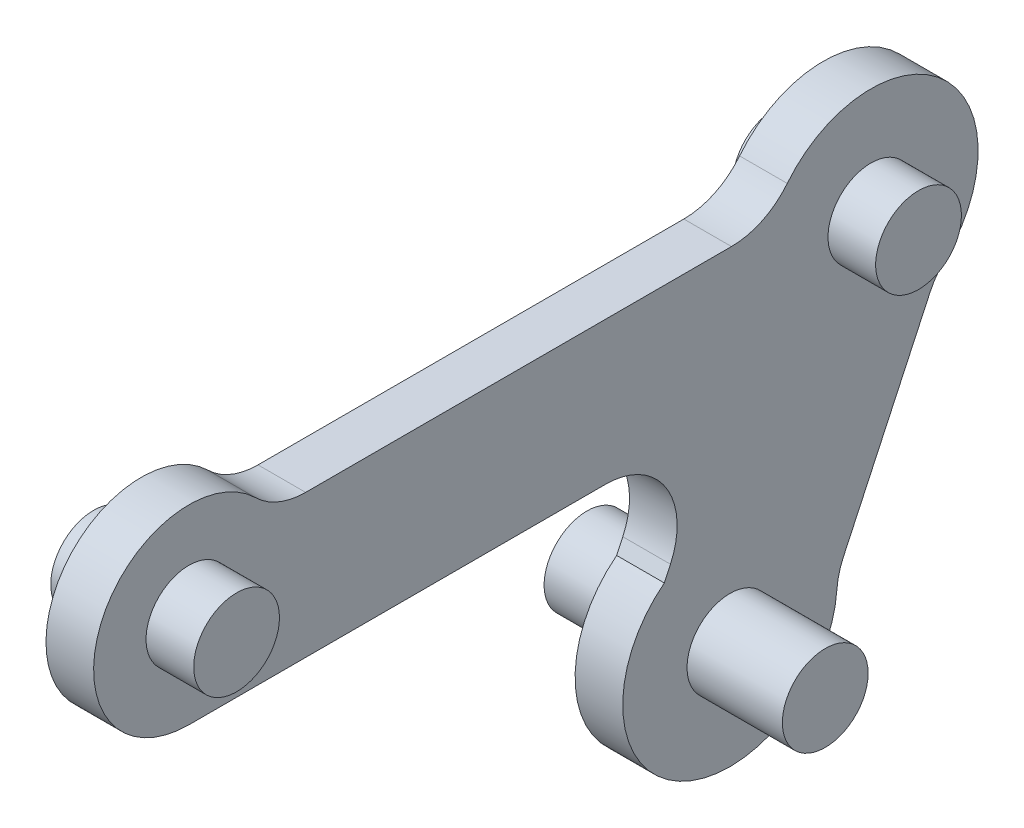
ISO-10303-21;
HEADER;
FILE_DESCRIPTION(('STEP AP214'),'2;1');
FILE_NAME('part.step','',(''),(''),'','','');
FILE_SCHEMA(('AUTOMOTIVE_DESIGN { 1 0 10303 214 1 1 1 1 }'));
ENDSEC;
DATA;
#1=APPLICATION_CONTEXT('core data for automotive mechanical design processes');
#2=APPLICATION_PROTOCOL_DEFINITION('international standard','automotive_design',2000,#1);
#3=PRODUCT_CONTEXT('',#1,'mechanical');
#4=PRODUCT('Part','Part','',(#3));
#5=PRODUCT_RELATED_PRODUCT_CATEGORY('part','',(#4));
#6=PRODUCT_DEFINITION_FORMATION('','',#4);
#7=PRODUCT_DEFINITION_CONTEXT('part definition',#1,'design');
#8=PRODUCT_DEFINITION('design','',#6,#7);
#9=PRODUCT_DEFINITION_SHAPE('','',#8);
#10=(LENGTH_UNIT() NAMED_UNIT(*) SI_UNIT(.MILLI.,.METRE.));
#11=(NAMED_UNIT(*) PLANE_ANGLE_UNIT() SI_UNIT($,.RADIAN.));
#12=(NAMED_UNIT(*) SI_UNIT($,.STERADIAN.) SOLID_ANGLE_UNIT());
#13=UNCERTAINTY_MEASURE_WITH_UNIT(LENGTH_MEASURE(1.E-05),#10,'distance_accuracy_value','');
#14=(GEOMETRIC_REPRESENTATION_CONTEXT(3) GLOBAL_UNCERTAINTY_ASSIGNED_CONTEXT((#13)) GLOBAL_UNIT_ASSIGNED_CONTEXT((#10,
#11,#12)) REPRESENTATION_CONTEXT('',''));
#15=CARTESIAN_POINT('',(0.,0.,0.));
#16=DIRECTION('',(0.,0.,1.));
#17=DIRECTION('',(1.,0.,0.));
#18=AXIS2_PLACEMENT_3D('',#15,#16,#17);
#19=CARTESIAN_POINT('',(0.,-2.,25.));
#20=DIRECTION('',(1.,0.,0.));
#21=DIRECTION('',(0.,0.,-1.));
#22=AXIS2_PLACEMENT_3D('',#19,#20,#21);
#23=PLANE('',#22);
#24=CARTESIAN_POINT('',(0.,-14.3787820654765,2.29142451622356));
#25=DIRECTION('',(1.,0.,0.));
#26=DIRECTION('',(0.,0.,-1.));
#27=AXIS2_PLACEMENT_3D('',#24,#25,#26);
#28=CIRCLE('',#27,1.8);
#29=CARTESIAN_POINT('',(0.,-14.3787820654765,0.491424516223557));
#30=VERTEX_POINT('',#29);
#31=EDGE_CURVE('E421',#30,#30,#28,.T.);
#32=ORIENTED_EDGE('',*,*,#31,.T.);
#33=EDGE_LOOP('',(#32));
#34=FACE_BOUND('',#33,.T.);
#35=CARTESIAN_POINT('',(0.,-1.69047304696279,-3.62523114814654));
#36=DIRECTION('',(1.,0.,0.));
#37=DIRECTION('',(0.,0.,-1.));
#38=AXIS2_PLACEMENT_3D('',#35,#36,#37);
#39=CIRCLE('',#38,1.8);
#40=CARTESIAN_POINT('',(0.,-1.69047304696279,-5.42523114814654));
#41=VERTEX_POINT('',#40);
#42=EDGE_CURVE('E409',#41,#41,#39,.T.);
#43=ORIENTED_EDGE('',*,*,#42,.T.);
#44=EDGE_LOOP('',(#43));
#45=FACE_BOUND('',#44,.T.);
#46=CARTESIAN_POINT('',(0.,-2.,25.));
#47=DIRECTION('',(1.,0.,0.));
#48=DIRECTION('',(0.,0.,-1.));
#49=AXIS2_PLACEMENT_3D('',#46,#47,#48);
#50=CIRCLE('',#49,1.8);
#51=CARTESIAN_POINT('',(0.,-2.,23.2));
#52=VERTEX_POINT('',#51);
#53=EDGE_CURVE('E403',#52,#52,#50,.T.);
#54=ORIENTED_EDGE('',*,*,#53,.T.);
#55=EDGE_LOOP('',(#54));
#56=FACE_BOUND('',#55,.T.);
#57=CARTESIAN_POINT('',(0.,-1.69047304696279,-3.62523114814653));
#58=DIRECTION('',(1.,0.,0.));
#59=DIRECTION('',(0.,0.,-1.));
#60=AXIS2_PLACEMENT_3D('',#57,#58,#59);
#61=CIRCLE('',#60,4.50000000000002);
#62=CARTESIAN_POINT('',(0.,-4.92965478602828,-6.74896315670695));
#63=VERTEX_POINT('',#62);
#64=CARTESIAN_POINT('',(0.,1.12381078121489,-0.113848723166622));
#65=VERTEX_POINT('',#64);
#66=EDGE_CURVE('E242',#63,#65,#61,.T.);
#67=ORIENTED_EDGE('',*,*,#66,.F.);
#68=CARTESIAN_POINT('',(0.,-7.08910927873859,-8.83145116241388));
#69=DIRECTION('',(1.,0.,0.));
#70=DIRECTION('',(0.,0.,-1.));
#71=AXIS2_PLACEMENT_3D('',#68,#69,#70);
#72=CIRCLE('',#71,3.);
#73=CARTESIAN_POINT('',(0.,-5.82125449351649,-6.11252780130393));
#74=VERTEX_POINT('',#73);
#75=EDGE_CURVE('E295',#63,#74,#72,.T.);
#76=ORIENTED_EDGE('',*,*,#75,.T.);
#77=DIRECTION('',(0.,-0.90630778703665,0.4226182617407));
#78=VECTOR('',#77,1.);
#79=CARTESIAN_POINT('',(0.,-3.38094609392561,-7.25046229629313));
#80=LINE('',#79,#78);
#81=CARTESIAN_POINT('',(0.,-13.6289467128478,-2.47174112691255));
#82=VERTEX_POINT('',#81);
#83=EDGE_CURVE('E253',#74,#82,#80,.T.);
#84=ORIENTED_EDGE('',*,*,#83,.T.);
#85=CARTESIAN_POINT('',(0.,-14.8968014980699,-5.1906644880225));
#86=DIRECTION('',(1.,0.,0.));
#87=DIRECTION('',(0.,0.,-1.));
#88=AXIS2_PLACEMENT_3D('',#85,#86,#87);
#89=CIRCLE('',#88,3.);
#90=CARTESIAN_POINT('',(0.,-14.6895937250323,-2.19782888632421));
#91=VERTEX_POINT('',#90);
#92=EDGE_CURVE('E291',#82,#91,#89,.T.);
#93=ORIENTED_EDGE('',*,*,#92,.T.);
#94=CARTESIAN_POINT('',(0.,-14.3787820654759,2.29142451622326));
#95=DIRECTION('',(1.,0.,0.));
#96=DIRECTION('',(0.,0.,-1.));
#97=AXIS2_PLACEMENT_3D('',#94,#95,#96);
#98=CIRCLE('',#97,4.50000000000002);
#99=CARTESIAN_POINT('',(0.,-10.8199076508771,5.0454057981339));
#100=VERTEX_POINT('',#99);
#101=EDGE_CURVE('E263',#100,#91,#98,.T.);
#102=ORIENTED_EDGE('',*,*,#101,.F.);
#103=DIRECTION('',(0.,-0.906307787036648,0.422618261740704));
#104=VECTOR('',#103,1.);
#105=CARTESIAN_POINT('',(0.,0.,0.));
#106=LINE('',#105,#104);
#107=CARTESIAN_POINT('',(0.,-10.2678547852221,4.78797931917258));
#108=VERTEX_POINT('',#107);
#109=EDGE_CURVE('E256',#108,#100,#106,.T.);
#110=ORIENTED_EDGE('',*,*,#109,.F.);
#111=CARTESIAN_POINT('',(0.,-9.00000000000001,7.50690268028253));
#112=DIRECTION('',(1.,0.,0.));
#113=DIRECTION('',(0.,0.,-1.));
#114=AXIS2_PLACEMENT_3D('',#111,#112,#113);
#115=CIRCLE('',#114,3.);
#116=CARTESIAN_POINT('',(0.,-6.,7.50690268028252));
#117=VERTEX_POINT('',#116);
#118=EDGE_CURVE('E235',#108,#117,#115,.T.);
#119=ORIENTED_EDGE('',*,*,#118,.T.);
#120=DIRECTION('',(0.,0.,-1.));
#121=VECTOR('',#120,1.);
#122=CARTESIAN_POINT('',(0.,-6.,25.));
#123=LINE('',#122,#121);
#124=CARTESIAN_POINT('',(0.,-5.99999999999999,25.));
#125=VERTEX_POINT('',#124);
#126=EDGE_CURVE('E227',#125,#117,#123,.T.);
#127=ORIENTED_EDGE('',*,*,#126,.F.);
#128=CARTESIAN_POINT('',(0.,-2.,25.));
#129=DIRECTION('',(1.,0.,0.));
#130=DIRECTION('',(0.,0.,-1.));
#131=AXIS2_PLACEMENT_3D('',#128,#129,#130);
#132=CIRCLE('',#131,3.99999999999999);
#133=CARTESIAN_POINT('',(0.,0.857142857142855,22.200583151105));
#134=VERTEX_POINT('',#133);
#135=EDGE_CURVE('E213',#134,#125,#132,.T.);
#136=ORIENTED_EDGE('',*,*,#135,.F.);
#137=CARTESIAN_POINT('',(0.,3.,20.1010205144337));
#138=DIRECTION('',(1.,0.,0.));
#139=DIRECTION('',(0.,0.,-1.));
#140=AXIS2_PLACEMENT_3D('',#137,#138,#139);
#141=CIRCLE('',#140,3.);
#142=CARTESIAN_POINT('',(0.,0.,20.1010205144337));
#143=VERTEX_POINT('',#142);
#144=EDGE_CURVE('E133',#134,#143,#141,.T.);
#145=ORIENTED_EDGE('',*,*,#144,.T.);
#146=DIRECTION('',(0.,0.,-1.));
#147=VECTOR('',#146,1.);
#148=CARTESIAN_POINT('',(0.,0.,25.));
#149=LINE('',#148,#147);
#150=CARTESIAN_POINT('',(0.,0.,2.22707289348664));
#151=VERTEX_POINT('',#150);
#152=EDGE_CURVE('E236',#143,#151,#149,.T.);
#153=ORIENTED_EDGE('',*,*,#152,.T.);
#154=CARTESIAN_POINT('',(0.,3.,2.22707289348664));
#155=DIRECTION('',(1.,0.,0.));
#156=DIRECTION('',(0.,0.,-1.));
#157=AXIS2_PLACEMENT_3D('',#154,#155,#156);
#158=CIRCLE('',#157,3.);
#159=EDGE_CURVE('E302',#151,#65,#158,.T.);
#160=ORIENTED_EDGE('',*,*,#159,.T.);
#161=EDGE_LOOP('',(#67,#76,#84,#93,#102,#110,#119,#127,#136,#145,#153,#160));
#162=FACE_BOUND('',#161,.T.);
#163=ADVANCED_FACE('F125',(#34,#45,#56,#162),#23,.F.);
#164=CARTESIAN_POINT('',(2.,-2.,25.));
#165=DIRECTION('',(1.,0.,0.));
#166=DIRECTION('',(0.,0.,-1.));
#167=AXIS2_PLACEMENT_3D('',#164,#165,#166);
#168=PLANE('',#167);
#169=CARTESIAN_POINT('',(2.,-14.3787820654765,2.29142451622356));
#170=DIRECTION('',(1.,0.,0.));
#171=DIRECTION('',(0.,0.,-1.00000000000004));
#172=AXIS2_PLACEMENT_3D('',#169,#170,#171);
#173=CIRCLE('',#172,1.8);
#174=CARTESIAN_POINT('',(2.,-14.3787820654765,0.491424516223483));
#175=VERTEX_POINT('',#174);
#176=EDGE_CURVE('E415',#175,#175,#173,.T.);
#177=ORIENTED_EDGE('',*,*,#176,.F.);
#178=EDGE_LOOP('',(#177));
#179=FACE_BOUND('',#178,.T.);
#180=CARTESIAN_POINT('',(2.,-1.69047304696279,-3.62523114814654));
#181=DIRECTION('',(1.,0.,0.));
#182=DIRECTION('',(0.,0.,-1.00000000000002));
#183=AXIS2_PLACEMENT_3D('',#180,#181,#182);
#184=CIRCLE('',#183,1.8);
#185=CARTESIAN_POINT('',(2.,-1.69047304696279,-5.42523114814658));
#186=VERTEX_POINT('',#185);
#187=EDGE_CURVE('E397',#186,#186,#184,.T.);
#188=ORIENTED_EDGE('',*,*,#187,.F.);
#189=EDGE_LOOP('',(#188));
#190=FACE_BOUND('',#189,.T.);
#191=CARTESIAN_POINT('',(2.,-2.,25.));
#192=DIRECTION('',(1.,0.,0.));
#193=DIRECTION('',(0.,0.,-1.));
#194=AXIS2_PLACEMENT_3D('',#191,#192,#193);
#195=CIRCLE('',#194,1.8);
#196=CARTESIAN_POINT('',(2.,-2.,23.2));
#197=VERTEX_POINT('',#196);
#198=EDGE_CURVE('E391',#197,#197,#195,.T.);
#199=ORIENTED_EDGE('',*,*,#198,.F.);
#200=EDGE_LOOP('',(#199));
#201=FACE_BOUND('',#200,.T.);
#202=DIRECTION('',(0.,-0.90630778703665,0.4226182617407));
#203=VECTOR('',#202,1.);
#204=CARTESIAN_POINT('',(2.,-3.38094609392561,-7.25046229629313));
#205=LINE('',#204,#203);
#206=CARTESIAN_POINT('',(2.,-5.82125449351649,-6.11252780130393));
#207=VERTEX_POINT('',#206);
#208=CARTESIAN_POINT('',(2.,-13.6289467128478,-2.47174112691255));
#209=VERTEX_POINT('',#208);
#210=EDGE_CURVE('E252',#207,#209,#205,.T.);
#211=ORIENTED_EDGE('',*,*,#210,.F.);
#212=CARTESIAN_POINT('',(2.,-7.08910927873859,-8.83145116241388));
#213=DIRECTION('',(1.,0.,0.));
#214=DIRECTION('',(0.,0.,-1.));
#215=AXIS2_PLACEMENT_3D('',#212,#213,#214);
#216=CIRCLE('',#215,3.);
#217=CARTESIAN_POINT('',(2.,-4.92965478602828,-6.74896315670695));
#218=VERTEX_POINT('',#217);
#219=EDGE_CURVE('E297',#207,#218,#216,.F.);
#220=ORIENTED_EDGE('',*,*,#219,.T.);
#221=CARTESIAN_POINT('',(2.,-1.69047304696279,-3.62523114814653));
#222=DIRECTION('',(1.,0.,0.));
#223=DIRECTION('',(0.,0.,-1.));
#224=AXIS2_PLACEMENT_3D('',#221,#222,#223);
#225=CIRCLE('',#224,4.50000000000002);
#226=CARTESIAN_POINT('',(2.,1.12381078121489,-0.113848723166622));
#227=VERTEX_POINT('',#226);
#228=EDGE_CURVE('E237',#218,#227,#225,.T.);
#229=ORIENTED_EDGE('',*,*,#228,.T.);
#230=CARTESIAN_POINT('',(2.,3.,2.22707289348664));
#231=DIRECTION('',(1.,0.,0.));
#232=DIRECTION('',(0.,0.,-1.));
#233=AXIS2_PLACEMENT_3D('',#230,#231,#232);
#234=CIRCLE('',#233,3.);
#235=CARTESIAN_POINT('',(2.,0.,2.22707289348664));
#236=VERTEX_POINT('',#235);
#237=EDGE_CURVE('E304',#227,#236,#234,.F.);
#238=ORIENTED_EDGE('',*,*,#237,.T.);
#239=DIRECTION('',(0.,0.,-1.));
#240=VECTOR('',#239,1.);
#241=CARTESIAN_POINT('',(2.,0.,25.));
#242=LINE('',#241,#240);
#243=CARTESIAN_POINT('',(2.,0.,20.1010205144337));
#244=VERTEX_POINT('',#243);
#245=EDGE_CURVE('E222',#244,#236,#242,.T.);
#246=ORIENTED_EDGE('',*,*,#245,.F.);
#247=CARTESIAN_POINT('',(2.,3.,20.1010205144337));
#248=DIRECTION('',(1.,0.,0.));
#249=DIRECTION('',(0.,0.,-1.));
#250=AXIS2_PLACEMENT_3D('',#247,#248,#249);
#251=CIRCLE('',#250,3.);
#252=CARTESIAN_POINT('',(2.,0.857142857142855,22.200583151105));
#253=VERTEX_POINT('',#252);
#254=EDGE_CURVE('E12',#244,#253,#251,.F.);
#255=ORIENTED_EDGE('',*,*,#254,.T.);
#256=CARTESIAN_POINT('',(2.,-2.,25.));
#257=DIRECTION('',(1.,0.,0.));
#258=DIRECTION('',(0.,0.,-1.));
#259=AXIS2_PLACEMENT_3D('',#256,#257,#258);
#260=CIRCLE('',#259,3.99999999999999);
#261=CARTESIAN_POINT('',(2.,-6.,25.));
#262=VERTEX_POINT('',#261);
#263=EDGE_CURVE('E221',#253,#262,#260,.T.);
#264=ORIENTED_EDGE('',*,*,#263,.T.);
#265=DIRECTION('',(0.,0.,-1.));
#266=VECTOR('',#265,1.);
#267=CARTESIAN_POINT('',(2.,-6.,25.));
#268=LINE('',#267,#266);
#269=CARTESIAN_POINT('',(2.,-6.,7.50690268028252));
#270=VERTEX_POINT('',#269);
#271=EDGE_CURVE('E230',#262,#270,#268,.T.);
#272=ORIENTED_EDGE('',*,*,#271,.T.);
#273=CARTESIAN_POINT('',(2.,-9.00000000000001,7.50690268028253));
#274=DIRECTION('',(1.,0.,0.));
#275=DIRECTION('',(0.,0.,-1.));
#276=AXIS2_PLACEMENT_3D('',#273,#274,#275);
#277=CIRCLE('',#276,3.);
#278=CARTESIAN_POINT('',(2.,-10.2678547852221,4.78797931917258));
#279=VERTEX_POINT('',#278);
#280=EDGE_CURVE('E300',#270,#279,#277,.F.);
#281=ORIENTED_EDGE('',*,*,#280,.T.);
#282=DIRECTION('',(0.,-0.906307787036648,0.422618261740704));
#283=VECTOR('',#282,1.);
#284=CARTESIAN_POINT('',(2.,0.,0.));
#285=LINE('',#284,#283);
#286=CARTESIAN_POINT('',(2.,-10.8199076508771,5.0454057981339));
#287=VERTEX_POINT('',#286);
#288=EDGE_CURVE('E250',#279,#287,#285,.T.);
#289=ORIENTED_EDGE('',*,*,#288,.T.);
#290=CARTESIAN_POINT('',(2.,-14.3787820654759,2.29142451622326));
#291=DIRECTION('',(1.,0.,0.));
#292=DIRECTION('',(0.,0.,-1.));
#293=AXIS2_PLACEMENT_3D('',#290,#291,#292);
#294=CIRCLE('',#293,4.50000000000002);
#295=CARTESIAN_POINT('',(2.,-14.6895937250323,-2.19782888632421));
#296=VERTEX_POINT('',#295);
#297=EDGE_CURVE('E258',#287,#296,#294,.T.);
#298=ORIENTED_EDGE('',*,*,#297,.T.);
#299=CARTESIAN_POINT('',(2.,-14.8968014980699,-5.1906644880225));
#300=DIRECTION('',(1.,0.,0.));
#301=DIRECTION('',(0.,0.,-1.));
#302=AXIS2_PLACEMENT_3D('',#299,#300,#301);
#303=CIRCLE('',#302,3.);
#304=EDGE_CURVE('E293',#296,#209,#303,.F.);
#305=ORIENTED_EDGE('',*,*,#304,.T.);
#306=EDGE_LOOP('',(#211,#220,#229,#238,#246,#255,#264,#272,#281,#289,#298,#305));
#307=FACE_BOUND('',#306,.T.);
#308=ADVANCED_FACE('F325',(#179,#190,#201,#307),#168,.T.);
#309=CARTESIAN_POINT('',(2.,-2.,25.));
#310=DIRECTION('',(-1.,0.,0.));
#311=DIRECTION('',(0.,0.,1.));
#312=AXIS2_PLACEMENT_3D('',#309,#310,#311);
#313=CYLINDRICAL_SURFACE('',#312,3.99999999999999);
#314=ORIENTED_EDGE('',*,*,#263,.F.);
#315=DIRECTION('',(-1.,0.,0.));
#316=VECTOR('',#315,1.);
#317=CARTESIAN_POINT('',(2.,0.857142857142856,22.200583151105));
#318=LINE('',#317,#316);
#319=EDGE_CURVE('E218',#253,#134,#318,.T.);
#320=ORIENTED_EDGE('',*,*,#319,.T.);
#321=ORIENTED_EDGE('',*,*,#135,.T.);
#322=DIRECTION('',(-1.,0.,0.));
#323=VECTOR('',#322,1.);
#324=CARTESIAN_POINT('',(2.,-6.,25.));
#325=LINE('',#324,#323);
#326=EDGE_CURVE('E216',#262,#125,#325,.T.);
#327=ORIENTED_EDGE('',*,*,#326,.F.);
#328=EDGE_LOOP('',(#314,#320,#321,#327));
#329=FACE_BOUND('',#328,.T.);
#330=ADVANCED_FACE('F215',(#329),#313,.T.);
#331=CARTESIAN_POINT('',(2.,-14.3787820654759,2.29142451622326));
#332=DIRECTION('',(-1.,0.,0.));
#333=DIRECTION('',(0.,0.,1.));
#334=AXIS2_PLACEMENT_3D('',#331,#332,#333);
#335=CYLINDRICAL_SURFACE('',#334,4.50000000000002);
#336=ORIENTED_EDGE('',*,*,#101,.T.);
#337=DIRECTION('',(-1.,0.,0.));
#338=VECTOR('',#337,1.);
#339=CARTESIAN_POINT('',(2.,-14.6895937250323,-2.19782888632421));
#340=LINE('',#339,#338);
#341=EDGE_CURVE('E273',#91,#296,#340,.F.);
#342=ORIENTED_EDGE('',*,*,#341,.T.);
#343=ORIENTED_EDGE('',*,*,#297,.F.);
#344=DIRECTION('',(-1.,0.,0.));
#345=VECTOR('',#344,1.);
#346=CARTESIAN_POINT('',(2.,-10.8199076508771,5.0454057981339));
#347=LINE('',#346,#345);
#348=EDGE_CURVE('E249',#287,#100,#347,.T.);
#349=ORIENTED_EDGE('',*,*,#348,.T.);
#350=EDGE_LOOP('',(#336,#342,#343,#349));
#351=FACE_BOUND('',#350,.T.);
#352=ADVANCED_FACE('F324',(#351),#335,.T.);
#353=CARTESIAN_POINT('',(2.,-3.38094609392561,-7.25046229629313));
#354=DIRECTION('',(0.,-0.4226182617407,-0.90630778703665));
#355=DIRECTION('',(0.,0.90630778703665,-0.4226182617407));
#356=AXIS2_PLACEMENT_3D('',#353,#354,#355);
#357=PLANE('',#356);
#358=ORIENTED_EDGE('',*,*,#210,.T.);
#359=DIRECTION('',(-1.,0.,0.));
#360=VECTOR('',#359,1.);
#361=CARTESIAN_POINT('',(2.,-13.6289467128478,-2.47174112691255));
#362=LINE('',#361,#360);
#363=EDGE_CURVE('E270',#209,#82,#362,.T.);
#364=ORIENTED_EDGE('',*,*,#363,.T.);
#365=ORIENTED_EDGE('',*,*,#83,.F.);
#366=DIRECTION('',(-1.,0.,0.));
#367=VECTOR('',#366,1.);
#368=CARTESIAN_POINT('',(2.,-5.82125449351649,-6.11252780130393));
#369=LINE('',#368,#367);
#370=EDGE_CURVE('E231',#74,#207,#369,.F.);
#371=ORIENTED_EDGE('',*,*,#370,.T.);
#372=EDGE_LOOP('',(#358,#364,#365,#371));
#373=FACE_BOUND('',#372,.T.);
#374=ADVANCED_FACE('F330',(#373),#357,.T.);
#375=CARTESIAN_POINT('',(2.,0.,0.));
#376=DIRECTION('',(0.,-0.422618261740704,-0.906307787036648));
#377=DIRECTION('',(0.,0.906307787036648,-0.422618261740704));
#378=AXIS2_PLACEMENT_3D('',#375,#376,#377);
#379=PLANE('',#378);
#380=ORIENTED_EDGE('',*,*,#288,.F.);
#381=DIRECTION('',(-1.,0.,0.));
#382=VECTOR('',#381,1.);
#383=CARTESIAN_POINT('',(0.,-10.2678547852221,4.78797931917258));
#384=LINE('',#383,#382);
#385=EDGE_CURVE('E280',#279,#108,#384,.T.);
#386=ORIENTED_EDGE('',*,*,#385,.T.);
#387=ORIENTED_EDGE('',*,*,#109,.T.);
#388=ORIENTED_EDGE('',*,*,#348,.F.);
#389=EDGE_LOOP('',(#380,#386,#387,#388));
#390=FACE_BOUND('',#389,.T.);
#391=ADVANCED_FACE('F333',(#390),#379,.F.);
#392=CARTESIAN_POINT('',(2.,-1.69047304696279,-3.62523114814653));
#393=DIRECTION('',(-1.,0.,0.));
#394=DIRECTION('',(0.,0.,1.));
#395=AXIS2_PLACEMENT_3D('',#392,#393,#394);
#396=CYLINDRICAL_SURFACE('',#395,4.50000000000002);
#397=ORIENTED_EDGE('',*,*,#228,.F.);
#398=DIRECTION('',(-1.,0.,0.));
#399=VECTOR('',#398,1.);
#400=CARTESIAN_POINT('',(2.,-4.92965478602828,-6.74896315670695));
#401=LINE('',#400,#399);
#402=EDGE_CURVE('E277',#218,#63,#401,.T.);
#403=ORIENTED_EDGE('',*,*,#402,.T.);
#404=ORIENTED_EDGE('',*,*,#66,.T.);
#405=DIRECTION('',(-1.,0.,0.));
#406=VECTOR('',#405,1.);
#407=CARTESIAN_POINT('',(2.,1.12381078121489,-0.113848723166622));
#408=LINE('',#407,#406);
#409=EDGE_CURVE('E275',#65,#227,#408,.F.);
#410=ORIENTED_EDGE('',*,*,#409,.T.);
#411=EDGE_LOOP('',(#397,#403,#404,#410));
#412=FACE_BOUND('',#411,.T.);
#413=ADVANCED_FACE('F338',(#412),#396,.T.);
#414=CARTESIAN_POINT('',(2.,0.,25.));
#415=DIRECTION('',(0.,1.,0.));
#416=DIRECTION('',(0.,0.,1.));
#417=AXIS2_PLACEMENT_3D('',#414,#415,#416);
#418=PLANE('',#417);
#419=ORIENTED_EDGE('',*,*,#245,.T.);
#420=DIRECTION('',(-1.,0.,0.));
#421=VECTOR('',#420,1.);
#422=CARTESIAN_POINT('',(2.,0.,2.22707289348664));
#423=LINE('',#422,#421);
#424=EDGE_CURVE('E287',#236,#151,#423,.T.);
#425=ORIENTED_EDGE('',*,*,#424,.T.);
#426=ORIENTED_EDGE('',*,*,#152,.F.);
#427=DIRECTION('',(-1.,0.,0.));
#428=VECTOR('',#427,1.);
#429=CARTESIAN_POINT('',(2.,0.,20.1010205144337));
#430=LINE('',#429,#428);
#431=EDGE_CURVE('E285',#143,#244,#430,.F.);
#432=ORIENTED_EDGE('',*,*,#431,.T.);
#433=EDGE_LOOP('',(#419,#425,#426,#432));
#434=FACE_BOUND('',#433,.T.);
#435=ADVANCED_FACE('F308',(#434),#418,.T.);
#436=CARTESIAN_POINT('',(2.,-6.,25.));
#437=DIRECTION('',(0.,1.,0.));
#438=DIRECTION('',(0.,0.,1.));
#439=AXIS2_PLACEMENT_3D('',#436,#437,#438);
#440=PLANE('',#439);
#441=ORIENTED_EDGE('',*,*,#126,.T.);
#442=DIRECTION('',(-1.,0.,0.));
#443=VECTOR('',#442,1.);
#444=CARTESIAN_POINT('',(2.,-6.,7.50690268028252));
#445=LINE('',#444,#443);
#446=EDGE_CURVE('E283',#117,#270,#445,.F.);
#447=ORIENTED_EDGE('',*,*,#446,.T.);
#448=ORIENTED_EDGE('',*,*,#271,.F.);
#449=ORIENTED_EDGE('',*,*,#326,.T.);
#450=EDGE_LOOP('',(#441,#447,#448,#449));
#451=FACE_BOUND('',#450,.T.);
#452=ADVANCED_FACE('F226',(#451),#440,.F.);
#453=CARTESIAN_POINT('',(2.,-14.8968014980699,-5.1906644880225));
#454=DIRECTION('',(-1.,0.,0.));
#455=DIRECTION('',(0.,0.,1.));
#456=AXIS2_PLACEMENT_3D('',#453,#454,#455);
#457=CYLINDRICAL_SURFACE('',#456,3.);
#458=ORIENTED_EDGE('',*,*,#304,.F.);
#459=ORIENTED_EDGE('',*,*,#341,.F.);
#460=ORIENTED_EDGE('',*,*,#92,.F.);
#461=ORIENTED_EDGE('',*,*,#363,.F.);
#462=EDGE_LOOP('',(#458,#459,#460,#461));
#463=FACE_BOUND('',#462,.T.);
#464=ADVANCED_FACE('F337',(#463),#457,.F.);
#465=CARTESIAN_POINT('',(2.,-7.08910927873859,-8.83145116241388));
#466=DIRECTION('',(-1.,0.,0.));
#467=DIRECTION('',(0.,0.,1.));
#468=AXIS2_PLACEMENT_3D('',#465,#466,#467);
#469=CYLINDRICAL_SURFACE('',#468,3.);
#470=ORIENTED_EDGE('',*,*,#219,.F.);
#471=ORIENTED_EDGE('',*,*,#370,.F.);
#472=ORIENTED_EDGE('',*,*,#75,.F.);
#473=ORIENTED_EDGE('',*,*,#402,.F.);
#474=EDGE_LOOP('',(#470,#471,#472,#473));
#475=FACE_BOUND('',#474,.T.);
#476=ADVANCED_FACE('F363',(#475),#469,.F.);
#477=CARTESIAN_POINT('',(2.,-9.00000000000001,7.50690268028253));
#478=DIRECTION('',(1.,0.,0.));
#479=DIRECTION('',(0.,0.,-1.));
#480=AXIS2_PLACEMENT_3D('',#477,#478,#479);
#481=CYLINDRICAL_SURFACE('',#480,3.);
#482=ORIENTED_EDGE('',*,*,#280,.F.);
#483=ORIENTED_EDGE('',*,*,#446,.F.);
#484=ORIENTED_EDGE('',*,*,#118,.F.);
#485=ORIENTED_EDGE('',*,*,#385,.F.);
#486=EDGE_LOOP('',(#482,#483,#484,#485));
#487=FACE_BOUND('',#486,.T.);
#488=ADVANCED_FACE('F321',(#487),#481,.F.);
#489=CARTESIAN_POINT('',(2.,3.,2.22707289348664));
#490=DIRECTION('',(-1.,0.,0.));
#491=DIRECTION('',(0.,0.,1.));
#492=AXIS2_PLACEMENT_3D('',#489,#490,#491);
#493=CYLINDRICAL_SURFACE('',#492,3.);
#494=ORIENTED_EDGE('',*,*,#237,.F.);
#495=ORIENTED_EDGE('',*,*,#409,.F.);
#496=ORIENTED_EDGE('',*,*,#159,.F.);
#497=ORIENTED_EDGE('',*,*,#424,.F.);
#498=EDGE_LOOP('',(#494,#495,#496,#497));
#499=FACE_BOUND('',#498,.T.);
#500=ADVANCED_FACE('F312',(#499),#493,.F.);
#501=CARTESIAN_POINT('',(2.,3.,20.1010205144337));
#502=DIRECTION('',(-1.,0.,0.));
#503=DIRECTION('',(0.,0.,1.));
#504=AXIS2_PLACEMENT_3D('',#501,#502,#503);
#505=CYLINDRICAL_SURFACE('',#504,3.);
#506=ORIENTED_EDGE('',*,*,#254,.F.);
#507=ORIENTED_EDGE('',*,*,#431,.F.);
#508=ORIENTED_EDGE('',*,*,#144,.F.);
#509=ORIENTED_EDGE('',*,*,#319,.F.);
#510=EDGE_LOOP('',(#506,#507,#508,#509));
#511=FACE_BOUND('',#510,.T.);
#512=ADVANCED_FACE('F127',(#511),#505,.F.);
#513=CARTESIAN_POINT('',(4.,-2.,25.));
#514=DIRECTION('',(-1.,0.,0.));
#515=DIRECTION('',(0.,0.,1.));
#516=AXIS2_PLACEMENT_3D('',#513,#514,#515);
#517=CYLINDRICAL_SURFACE('',#516,1.8);
#518=CARTESIAN_POINT('',(4.,-2.,25.));
#519=DIRECTION('',(1.,0.,0.));
#520=DIRECTION('',(0.,0.,-1.));
#521=AXIS2_PLACEMENT_3D('',#518,#519,#520);
#522=CIRCLE('',#521,1.8);
#523=CARTESIAN_POINT('',(4.,-2.,23.2));
#524=VERTEX_POINT('',#523);
#525=EDGE_CURVE('E266',#524,#524,#522,.T.);
#526=ORIENTED_EDGE('',*,*,#525,.F.);
#527=EDGE_LOOP('',(#526));
#528=FACE_BOUND('',#527,.T.);
#529=ORIENTED_EDGE('',*,*,#198,.T.);
#530=EDGE_LOOP('',(#529));
#531=FACE_BOUND('',#530,.T.);
#532=ADVANCED_FACE('F311',(#528,#531),#517,.T.);
#533=CARTESIAN_POINT('',(4.,0.,0.));
#534=DIRECTION('',(1.,0.,0.));
#535=DIRECTION('',(0.,0.,-1.));
#536=AXIS2_PLACEMENT_3D('',#533,#534,#535);
#537=PLANE('',#536);
#538=ORIENTED_EDGE('',*,*,#525,.T.);
#539=EDGE_LOOP('',(#538));
#540=FACE_BOUND('',#539,.T.);
#541=ADVANCED_FACE('F318',(#540),#537,.T.);
#542=CARTESIAN_POINT('',(4.,-1.69047304696279,-3.62523114814654));
#543=DIRECTION('',(-1.,0.,0.));
#544=DIRECTION('',(0.,0.,1.));
#545=AXIS2_PLACEMENT_3D('',#542,#543,#544);
#546=CYLINDRICAL_SURFACE('',#545,1.8);
#547=CARTESIAN_POINT('',(4.,-1.69047304696279,-3.62523114814654));
#548=DIRECTION('',(1.,0.,0.));
#549=DIRECTION('',(0.,0.,-1.00000000000002));
#550=AXIS2_PLACEMENT_3D('',#547,#548,#549);
#551=CIRCLE('',#550,1.8);
#552=CARTESIAN_POINT('',(4.,-1.69047304696279,-5.42523114814658));
#553=VERTEX_POINT('',#552);
#554=EDGE_CURVE('E394',#553,#553,#551,.T.);
#555=ORIENTED_EDGE('',*,*,#554,.F.);
#556=EDGE_LOOP('',(#555));
#557=FACE_BOUND('',#556,.T.);
#558=ORIENTED_EDGE('',*,*,#187,.T.);
#559=EDGE_LOOP('',(#558));
#560=FACE_BOUND('',#559,.T.);
#561=ADVANCED_FACE('F464',(#557,#560),#546,.T.);
#562=CARTESIAN_POINT('',(4.,0.,0.));
#563=DIRECTION('',(1.,0.,0.));
#564=DIRECTION('',(0.,0.,-1.00000000000002));
#565=AXIS2_PLACEMENT_3D('',#562,#563,#564);
#566=PLANE('',#565);
#567=ORIENTED_EDGE('',*,*,#554,.T.);
#568=EDGE_LOOP('',(#567));
#569=FACE_BOUND('',#568,.T.);
#570=ADVANCED_FACE('F460',(#569),#566,.T.);
#571=CARTESIAN_POINT('',(-2.,-2.,25.));
#572=DIRECTION('',(1.,0.,0.));
#573=DIRECTION('',(0.,0.,-1.));
#574=AXIS2_PLACEMENT_3D('',#571,#572,#573);
#575=CYLINDRICAL_SURFACE('',#574,1.8);
#576=CARTESIAN_POINT('',(-2.,-2.,25.));
#577=DIRECTION('',(1.,0.,0.));
#578=DIRECTION('',(0.,0.,-1.));
#579=AXIS2_PLACEMENT_3D('',#576,#577,#578);
#580=CIRCLE('',#579,1.8);
#581=CARTESIAN_POINT('',(-2.,-2.,23.2));
#582=VERTEX_POINT('',#581);
#583=EDGE_CURVE('E400',#582,#582,#580,.T.);
#584=ORIENTED_EDGE('',*,*,#583,.T.);
#585=EDGE_LOOP('',(#584));
#586=FACE_BOUND('',#585,.T.);
#587=ORIENTED_EDGE('',*,*,#53,.F.);
#588=EDGE_LOOP('',(#587));
#589=FACE_BOUND('',#588,.T.);
#590=ADVANCED_FACE('F456',(#586,#589),#575,.T.);
#591=CARTESIAN_POINT('',(-2.,-2.,25.));
#592=DIRECTION('',(1.,0.,0.));
#593=DIRECTION('',(0.,0.,-1.));
#594=AXIS2_PLACEMENT_3D('',#591,#592,#593);
#595=PLANE('',#594);
#596=ORIENTED_EDGE('',*,*,#583,.F.);
#597=EDGE_LOOP('',(#596));
#598=FACE_BOUND('',#597,.T.);
#599=ADVANCED_FACE('F452',(#598),#595,.F.);
#600=CARTESIAN_POINT('',(-2.,-1.69047304696279,-3.62523114814654));
#601=DIRECTION('',(1.,0.,0.));
#602=DIRECTION('',(0.,0.,-1.));
#603=AXIS2_PLACEMENT_3D('',#600,#601,#602);
#604=CYLINDRICAL_SURFACE('',#603,1.8);
#605=CARTESIAN_POINT('',(-2.,-1.69047304696279,-3.62523114814654));
#606=DIRECTION('',(1.,0.,0.));
#607=DIRECTION('',(0.,0.,-1.));
#608=AXIS2_PLACEMENT_3D('',#605,#606,#607);
#609=CIRCLE('',#608,1.8);
#610=CARTESIAN_POINT('',(-2.,-1.69047304696279,-5.42523114814654));
#611=VERTEX_POINT('',#610);
#612=EDGE_CURVE('E406',#611,#611,#609,.T.);
#613=ORIENTED_EDGE('',*,*,#612,.T.);
#614=EDGE_LOOP('',(#613));
#615=FACE_BOUND('',#614,.T.);
#616=ORIENTED_EDGE('',*,*,#42,.F.);
#617=EDGE_LOOP('',(#616));
#618=FACE_BOUND('',#617,.T.);
#619=ADVANCED_FACE('F448',(#615,#618),#604,.T.);
#620=CARTESIAN_POINT('',(-2.,-1.69047304696279,-3.62523114814654));
#621=DIRECTION('',(1.,0.,0.));
#622=DIRECTION('',(0.,0.,-1.));
#623=AXIS2_PLACEMENT_3D('',#620,#621,#622);
#624=PLANE('',#623);
#625=ORIENTED_EDGE('',*,*,#612,.F.);
#626=EDGE_LOOP('',(#625));
#627=FACE_BOUND('',#626,.T.);
#628=ADVANCED_FACE('F444',(#627),#624,.F.);
#629=CARTESIAN_POINT('',(6.,-14.3787820654765,2.29142451622356));
#630=DIRECTION('',(-1.,0.,0.));
#631=DIRECTION('',(0.,0.,1.));
#632=AXIS2_PLACEMENT_3D('',#629,#630,#631);
#633=CYLINDRICAL_SURFACE('',#632,1.8);
#634=CARTESIAN_POINT('',(6.,-14.3787820654765,2.29142451622356));
#635=DIRECTION('',(1.,0.,0.));
#636=DIRECTION('',(0.,0.,-1.00000000000004));
#637=AXIS2_PLACEMENT_3D('',#634,#635,#636);
#638=CIRCLE('',#637,1.8);
#639=CARTESIAN_POINT('',(6.,-14.3787820654765,0.491424516223483));
#640=VERTEX_POINT('',#639);
#641=EDGE_CURVE('E412',#640,#640,#638,.T.);
#642=ORIENTED_EDGE('',*,*,#641,.F.);
#643=EDGE_LOOP('',(#642));
#644=FACE_BOUND('',#643,.T.);
#645=ORIENTED_EDGE('',*,*,#176,.T.);
#646=EDGE_LOOP('',(#645));
#647=FACE_BOUND('',#646,.T.);
#648=ADVANCED_FACE('F440',(#644,#647),#633,.T.);
#649=CARTESIAN_POINT('',(6.,0.,0.));
#650=DIRECTION('',(1.,0.,0.));
#651=DIRECTION('',(0.,0.,-1.00000000000004));
#652=AXIS2_PLACEMENT_3D('',#649,#650,#651);
#653=PLANE('',#652);
#654=ORIENTED_EDGE('',*,*,#641,.T.);
#655=EDGE_LOOP('',(#654));
#656=FACE_BOUND('',#655,.T.);
#657=ADVANCED_FACE('F435',(#656),#653,.T.);
#658=CARTESIAN_POINT('',(-4.,-14.3787820654765,2.29142451622356));
#659=DIRECTION('',(1.,0.,0.));
#660=DIRECTION('',(0.,0.,-1.));
#661=AXIS2_PLACEMENT_3D('',#658,#659,#660);
#662=CYLINDRICAL_SURFACE('',#661,1.8);
#663=CARTESIAN_POINT('',(-4.,-14.3787820654765,2.29142451622356));
#664=DIRECTION('',(1.,0.,0.));
#665=DIRECTION('',(0.,0.,-1.));
#666=AXIS2_PLACEMENT_3D('',#663,#664,#665);
#667=CIRCLE('',#666,1.8);
#668=CARTESIAN_POINT('',(-4.,-14.3787820654765,0.491424516223557));
#669=VERTEX_POINT('',#668);
#670=EDGE_CURVE('E418',#669,#669,#667,.T.);
#671=ORIENTED_EDGE('',*,*,#670,.T.);
#672=EDGE_LOOP('',(#671));
#673=FACE_BOUND('',#672,.T.);
#674=ORIENTED_EDGE('',*,*,#31,.F.);
#675=EDGE_LOOP('',(#674));
#676=FACE_BOUND('',#675,.T.);
#677=ADVANCED_FACE('F426',(#673,#676),#662,.T.);
#678=CARTESIAN_POINT('',(-4.,-14.3787820654765,2.29142451622356));
#679=DIRECTION('',(1.,0.,0.));
#680=DIRECTION('',(0.,0.,-1.));
#681=AXIS2_PLACEMENT_3D('',#678,#679,#680);
#682=PLANE('',#681);
#683=ORIENTED_EDGE('',*,*,#670,.F.);
#684=EDGE_LOOP('',(#683));
#685=FACE_BOUND('',#684,.T.);
#686=ADVANCED_FACE('F429',(#685),#682,.F.);
#687=CLOSED_SHELL('',(#163,#308,#330,#352,#374,#391,#413,#435,#452,#464,#476,#488,#500,#512,
#532,#541,#561,#570,#590,#599,#619,#628,#648,#657,#677,#686));
#688=MANIFOLD_SOLID_BREP('B2',#687);
#689=ADVANCED_BREP_SHAPE_REPRESENTATION('',(#18,#688),#14);
#690=SHAPE_DEFINITION_REPRESENTATION(#9,#689);
ENDSEC;
END-ISO-10303-21;
